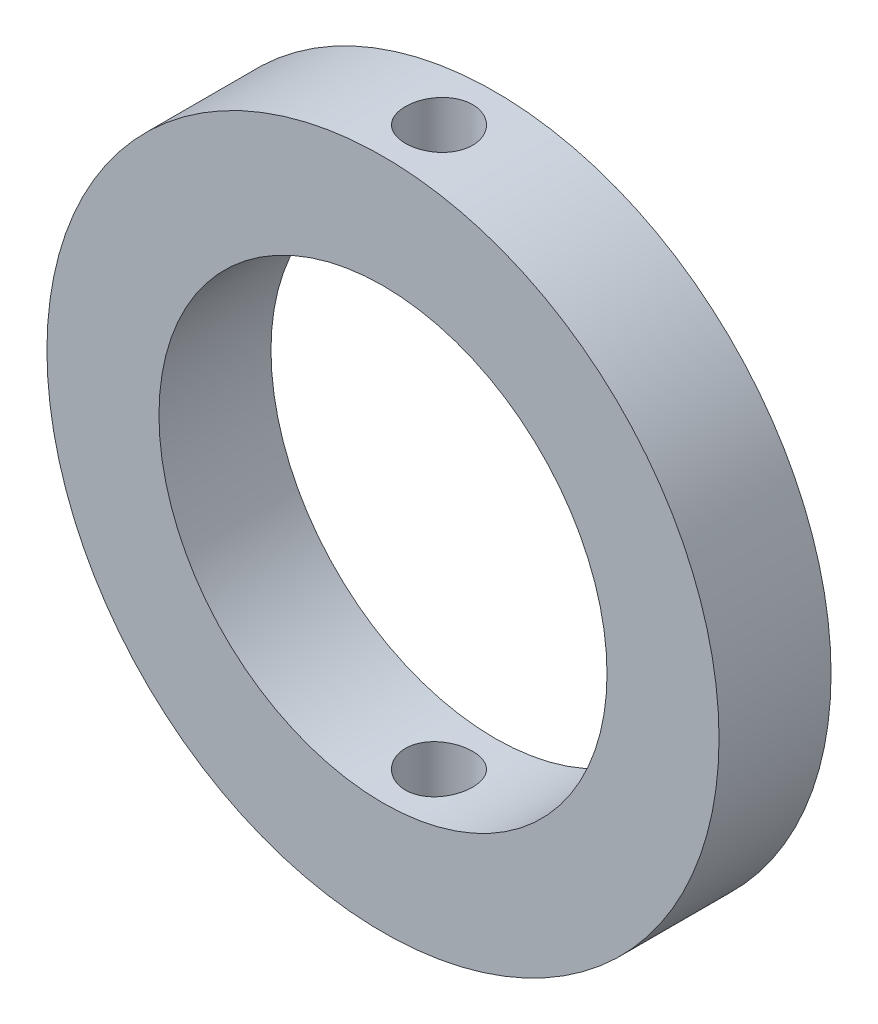
ISO-10303-21;
HEADER;
FILE_DESCRIPTION(('STEP AP214'),'2;1');
FILE_NAME('part.step','',(''),(''),'','','');
FILE_SCHEMA(('AUTOMOTIVE_DESIGN { 1 0 10303 214 1 1 1 1 }'));
ENDSEC;
DATA;
#1=APPLICATION_CONTEXT('core data for automotive mechanical design processes');
#2=APPLICATION_PROTOCOL_DEFINITION('international standard','automotive_design',2000,#1);
#3=PRODUCT_CONTEXT('',#1,'mechanical');
#4=PRODUCT('Part','Part','',(#3));
#5=PRODUCT_RELATED_PRODUCT_CATEGORY('part','',(#4));
#6=PRODUCT_DEFINITION_FORMATION('','',#4);
#7=PRODUCT_DEFINITION_CONTEXT('part definition',#1,'design');
#8=PRODUCT_DEFINITION('design','',#6,#7);
#9=PRODUCT_DEFINITION_SHAPE('','',#8);
#10=(LENGTH_UNIT() NAMED_UNIT(*) SI_UNIT(.MILLI.,.METRE.));
#11=(NAMED_UNIT(*) PLANE_ANGLE_UNIT() SI_UNIT($,.RADIAN.));
#12=(NAMED_UNIT(*) SI_UNIT($,.STERADIAN.) SOLID_ANGLE_UNIT());
#13=UNCERTAINTY_MEASURE_WITH_UNIT(LENGTH_MEASURE(1.E-05),#10,'distance_accuracy_value','');
#14=(GEOMETRIC_REPRESENTATION_CONTEXT(3) GLOBAL_UNCERTAINTY_ASSIGNED_CONTEXT((#13)) GLOBAL_UNIT_ASSIGNED_CONTEXT((#10,
#11,#12)) REPRESENTATION_CONTEXT('',''));
#15=CARTESIAN_POINT('',(0.,0.,0.));
#16=DIRECTION('',(0.,0.,1.));
#17=DIRECTION('',(1.,0.,0.));
#18=AXIS2_PLACEMENT_3D('',#15,#16,#17);
#19=CARTESIAN_POINT('',(0.,0.,10.));
#20=DIRECTION('',(0.,0.,1.));
#21=DIRECTION('',(1.,0.,0.));
#22=AXIS2_PLACEMENT_3D('',#19,#20,#21);
#23=PLANE('',#22);
#24=CARTESIAN_POINT('',(0.,0.,10.));
#25=DIRECTION('',(0.,0.,1.));
#26=DIRECTION('',(1.,0.,0.));
#27=AXIS2_PLACEMENT_3D('',#24,#25,#26);
#28=CIRCLE('',#27,30.);
#29=CARTESIAN_POINT('',(30.,0.,10.));
#30=VERTEX_POINT('',#29);
#31=EDGE_CURVE('E10',#30,#30,#28,.T.);
#32=ORIENTED_EDGE('',*,*,#31,.T.);
#33=EDGE_LOOP('',(#32));
#34=FACE_BOUND('',#33,.T.);
#35=CARTESIAN_POINT('',(0.,0.,10.));
#36=DIRECTION('',(0.,0.,1.));
#37=DIRECTION('',(1.,0.,0.));
#38=AXIS2_PLACEMENT_3D('',#35,#36,#37);
#39=CIRCLE('',#38,20.);
#40=CARTESIAN_POINT('',(20.,0.,10.));
#41=VERTEX_POINT('',#40);
#42=EDGE_CURVE('E58',#41,#41,#39,.T.);
#43=ORIENTED_EDGE('',*,*,#42,.F.);
#44=EDGE_LOOP('',(#43));
#45=FACE_BOUND('',#44,.T.);
#46=ADVANCED_FACE('F37',(#34,#45),#23,.T.);
#47=CARTESIAN_POINT('',(0.,0.,0.));
#48=DIRECTION('',(0.,0.,1.));
#49=DIRECTION('',(1.,0.,0.));
#50=AXIS2_PLACEMENT_3D('',#47,#48,#49);
#51=PLANE('',#50);
#52=CARTESIAN_POINT('',(0.,0.,0.));
#53=DIRECTION('',(0.,0.,1.));
#54=DIRECTION('',(1.,0.,0.));
#55=AXIS2_PLACEMENT_3D('',#52,#53,#54);
#56=CIRCLE('',#55,30.);
#57=CARTESIAN_POINT('',(30.,0.,0.));
#58=VERTEX_POINT('',#57);
#59=EDGE_CURVE('E52',#58,#58,#56,.T.);
#60=ORIENTED_EDGE('',*,*,#59,.F.);
#61=EDGE_LOOP('',(#60));
#62=FACE_BOUND('',#61,.T.);
#63=CARTESIAN_POINT('',(0.,0.,0.));
#64=DIRECTION('',(0.,0.,1.));
#65=DIRECTION('',(1.,0.,0.));
#66=AXIS2_PLACEMENT_3D('',#63,#64,#65);
#67=CIRCLE('',#66,20.);
#68=CARTESIAN_POINT('',(20.,0.,0.));
#69=VERTEX_POINT('',#68);
#70=EDGE_CURVE('E61',#69,#69,#67,.T.);
#71=ORIENTED_EDGE('',*,*,#70,.T.);
#72=EDGE_LOOP('',(#71));
#73=FACE_BOUND('',#72,.T.);
#74=ADVANCED_FACE('F102',(#62,#73),#51,.F.);
#75=CARTESIAN_POINT('',(0.,0.,10.));
#76=DIRECTION('',(0.,0.,-1.));
#77=DIRECTION('',(-1.,0.,0.));
#78=AXIS2_PLACEMENT_3D('',#75,#76,#77);
#79=CYLINDRICAL_SURFACE('',#78,30.);
#80=CARTESIAN_POINT('',(0.,-30.,8.));
#81=CARTESIAN_POINT('',(0.168061061374672,-29.9999980656231,7.99999272229886));
#82=CARTESIAN_POINT('',(0.336233235503319,-29.9985727678862,7.98583019331067));
#83=CARTESIAN_POINT('',(0.667915195490511,-29.9930240278421,7.92954688912872));
#84=CARTESIAN_POINT('',(0.831419637506484,-29.9888976130208,7.88739531192623));
#85=CARTESIAN_POINT('',(1.14891502636024,-29.9784124368921,7.7763732782065));
#86=CARTESIAN_POINT('',(1.30291165384473,-29.9720550240212,7.70751895844458));
#87=CARTESIAN_POINT('',(1.59712848288122,-29.9578187218292,7.54507727620507));
#88=CARTESIAN_POINT('',(1.73735141633723,-29.9499401351439,7.45149483199959));
#89=CARTESIAN_POINT('',(2.00057865202225,-29.9335123302397,7.24189190701318));
#90=CARTESIAN_POINT('',(2.12352643450468,-29.924961047216,7.1258006017939));
#91=CARTESIAN_POINT('',(2.34822756429295,-29.9081687071879,6.87462639721091));
#92=CARTESIAN_POINT('',(2.44997993124796,-29.8999276645475,6.73954261987284));
#93=CARTESIAN_POINT('',(2.62960191133085,-29.8846677465835,6.45386440494914));
#94=CARTESIAN_POINT('',(2.70742039636464,-29.8776515013271,6.30323766771542));
#95=CARTESIAN_POINT('',(2.83663915422828,-29.8656611263957,5.99097324228506));
#96=CARTESIAN_POINT('',(2.88804007977387,-29.8606869462667,5.82933582624815));
#97=CARTESIAN_POINT('',(2.96279712480568,-29.8533625221893,5.50021459740197));
#98=CARTESIAN_POINT('',(2.98624695901139,-29.8510035119429,5.33275226944338));
#99=CARTESIAN_POINT('',(3.00472585540608,-29.8491492918158,4.99625340981266));
#100=CARTESIAN_POINT('',(2.9997556646124,-29.8496540066624,4.82721691963382));
#101=CARTESIAN_POINT('',(2.96161284075803,-29.853462206968,4.49301407092004));
#102=CARTESIAN_POINT('',(2.92854253237365,-29.8567555377195,4.32783590201392));
#103=CARTESIAN_POINT('',(2.83529743245176,-29.8657540286226,4.00538611039672));
#104=CARTESIAN_POINT('',(2.77512227476724,-29.8714592213548,3.84811459452491));
#105=CARTESIAN_POINT('',(2.62926268164452,-29.8846502835621,3.54561923810333));
#106=CARTESIAN_POINT('',(2.54353284815994,-29.8921393172447,3.40041743153205));
#107=CARTESIAN_POINT('',(2.34903008205968,-29.9080515519864,3.12642435526435));
#108=CARTESIAN_POINT('',(2.24025647500952,-29.9164747803835,2.99763356605471));
#109=CARTESIAN_POINT('',(2.00218233723621,-29.9333515593897,2.75952381803292));
#110=CARTESIAN_POINT('',(1.87279343655409,-29.9418050799899,2.65029319435758));
#111=CARTESIAN_POINT('',(1.59746844521134,-29.9577548723555,2.45508910126884));
#112=CARTESIAN_POINT('',(1.4515323359988,-29.9652511430477,2.36911565793057));
#113=CARTESIAN_POINT('',(1.14719431707709,-29.9784442700129,2.22286993906924));
#114=CARTESIAN_POINT('',(0.98879023916971,-29.9841408124431,2.16260214554582));
#115=CARTESIAN_POINT('',(0.664041651989797,-29.9930894232423,2.06954324986474));
#116=CARTESIAN_POINT('',(0.497697380329801,-29.9963415647119,2.03675132602813));
#117=CARTESIAN_POINT('',(0.162555297275711,-30.0000255500493,1.9996870767957));
#118=CARTESIAN_POINT('',(-0.00622890631647575,-30.0004694480321,1.9952928552425));
#119=CARTESIAN_POINT('',(-0.342131379947099,-29.9985192527039,2.01482858914629));
#120=CARTESIAN_POINT('',(-0.50924967246141,-29.996125197734,2.03875816194584));
#121=CARTESIAN_POINT('',(-0.836724620504024,-29.9887758461758,2.11416108626473));
#122=CARTESIAN_POINT('',(-0.997094546916058,-29.9838258575412,2.16557736343403));
#123=CARTESIAN_POINT('',(-1.30693296415134,-29.9719199658183,2.29443552211181));
#124=CARTESIAN_POINT('',(-1.45640121047135,-29.9649640177576,2.37187798711819));
#125=CARTESIAN_POINT('',(-1.74074454051643,-29.9497942599127,2.55089251599174));
#126=CARTESIAN_POINT('',(-1.87556897924675,-29.9415763081032,2.65254466677745));
#127=CARTESIAN_POINT('',(-2.12628486993563,-29.9248179860856,2.87697820322278));
#128=CARTESIAN_POINT('',(-2.24217584654753,-29.9162776077891,2.99976011921095));
#129=CARTESIAN_POINT('',(-2.45215832966144,-29.8998007242226,3.263499723977));
#130=CARTESIAN_POINT('',(-2.54616983603863,-29.8918665041693,3.40452126962787));
#131=CARTESIAN_POINT('',(-2.70917477623148,-29.8775349738267,3.70042208044006));
#132=CARTESIAN_POINT('',(-2.77816855216165,-29.8711376425211,3.85530115606519));
#133=CARTESIAN_POINT('',(-2.88904562605342,-29.8606184290215,4.17424621839738));
#134=CARTESIAN_POINT('',(-2.93097652443558,-29.8564925534936,4.33829552027336));
#135=CARTESIAN_POINT('',(-2.98669202138839,-29.8509709584863,4.67114959388232));
#136=CARTESIAN_POINT('',(-3.00047742719855,-29.8495751607056,4.83995422908702));
#137=CARTESIAN_POINT('',(-2.99949941541377,-29.8496733932269,5.17673206507011));
#138=CARTESIAN_POINT('',(-2.98486166877934,-29.8511547026103,5.34470564864844));
#139=CARTESIAN_POINT('',(-2.92771635889096,-29.8568131166864,5.67579475150486));
#140=CARTESIAN_POINT('',(-2.88520876428648,-29.8609902244115,5.83891026531794));
#141=CARTESIAN_POINT('',(-2.77356505889251,-29.8715660478956,6.15565204714357));
#142=CARTESIAN_POINT('',(-2.70443263302275,-29.8779644562108,6.30927962488917));
#143=CARTESIAN_POINT('',(-2.54151466473313,-29.8922625551808,6.6027706750131));
#144=CARTESIAN_POINT('',(-2.44772926036624,-29.9001622374285,6.74263422446189));
#145=CARTESIAN_POINT('',(-2.23769566885599,-29.9166146162909,7.00527102341581));
#146=CARTESIAN_POINT('',(-2.12135384667081,-29.9251699418025,7.12796922910126));
#147=CARTESIAN_POINT('',(-1.86969509767533,-29.9419456418635,7.35215669809897));
#148=CARTESIAN_POINT('',(-1.73437363232477,-29.9501659356893,7.45364087407151));
#149=CARTESIAN_POINT('',(-1.44822430248387,-29.9653668620748,7.63272036156386));
#150=CARTESIAN_POINT('',(-1.29735824804029,-29.9723443208044,7.71025487283555));
#151=CARTESIAN_POINT('',(-0.984774837301653,-29.9842388774969,7.8387872684716));
#152=CARTESIAN_POINT('',(-0.823069949476829,-29.9891582972896,7.88981507286064));
#153=CARTESIAN_POINT('',(-0.550374784217113,-29.995146413212,7.9511618512544));
#154=CARTESIAN_POINT('',(-0.441127658533526,-29.996958020755,7.96945113289807));
#155=CARTESIAN_POINT('',(-0.221269742451939,-29.9993854485236,7.99387257818529));
#156=CARTESIAN_POINT('',(-0.110658957679674,-30.0000012736807,8.00000479196559));
#157=CARTESIAN_POINT('',(0.,-30.,8.));
#158=B_SPLINE_CURVE_WITH_KNOTS('',3,(#80,#81,#82,#83,#84,#85,#86,#87,#88,#89,#90,#91,#92,#93,
#94,#95,#96,#97,#98,#99,#100,#101,#102,#103,#104,#105,#106,#107,#108,#109,#110,#111,#112,#113,
#114,#115,#116,#117,#118,#119,#120,#121,#122,#123,#124,#125,#126,#127,#128,#129,#130,#131,#132,
#133,#134,#135,#136,#137,#138,#139,#140,#141,#142,#143,#144,#145,#146,#147,#148,#149,#150,#151,
#152,#153,#154,#155,#156,#157),.UNSPECIFIED.,.T.,.F.,(4,2,2,2,2,2,2,2,2,2,2,2,2,2,2,2,2,2,2,2,2,
2,2,2,2,2,2,2,2,2,2,2,2,2,2,2,2,2,4),(0.,0.503779098805421,1.00811352850646,1.51214365719661,
2.01607361274835,2.52161570586884,3.02718117662118,3.53381926416665,4.04044483327512,
4.5453669613559,5.0502758176733,5.55335392323331,6.05643882484901,6.56042284118684,
7.06442160993376,7.57064202588619,8.07686300939315,8.58317222080744,9.08946629026318,
9.59358565823273,10.0976982155743,10.6007680588291,11.103849181484,11.608618222461,
12.1133999343069,12.619999308258,13.1265917542612,13.6322907177901,14.1379751771876,
14.6414288788187,15.1448831467812,15.648267760884,16.1516495561688,16.6571675228296,
17.1628065791087,17.6697189307873,18.1760578438588,18.5077700169705,18.8394808220708),.UNSPECIFIED.);
#159=CARTESIAN_POINT('',(0.,-30.,8.));
#160=VERTEX_POINT('',#159);
#161=EDGE_CURVE('E88',#160,#160,#158,.T.);
#162=ORIENTED_EDGE('',*,*,#161,.T.);
#163=EDGE_LOOP('',(#162));
#164=FACE_BOUND('',#163,.T.);
#165=CARTESIAN_POINT('',(0.,30.,8.));
#166=CARTESIAN_POINT('',(-0.168061061374672,29.9999980656231,7.99999272229886));
#167=CARTESIAN_POINT('',(-0.336233235503319,29.9985727678862,7.98583019331067));
#168=CARTESIAN_POINT('',(-0.667915195490511,29.9930240278421,7.92954688912872));
#169=CARTESIAN_POINT('',(-0.831419637506484,29.9888976130208,7.88739531192623));
#170=CARTESIAN_POINT('',(-1.14891502636024,29.9784124368921,7.7763732782065));
#171=CARTESIAN_POINT('',(-1.30291165384473,29.9720550240212,7.70751895844458));
#172=CARTESIAN_POINT('',(-1.59712848288122,29.9578187218292,7.54507727620507));
#173=CARTESIAN_POINT('',(-1.73735141633723,29.9499401351439,7.45149483199959));
#174=CARTESIAN_POINT('',(-2.00057865202225,29.9335123302397,7.24189190701318));
#175=CARTESIAN_POINT('',(-2.12352643450468,29.924961047216,7.1258006017939));
#176=CARTESIAN_POINT('',(-2.34822756429295,29.9081687071879,6.87462639721091));
#177=CARTESIAN_POINT('',(-2.44997993124796,29.8999276645475,6.73954261987284));
#178=CARTESIAN_POINT('',(-2.62960191133085,29.8846677465835,6.45386440494914));
#179=CARTESIAN_POINT('',(-2.70742039636464,29.8776515013271,6.30323766771542));
#180=CARTESIAN_POINT('',(-2.83663915422828,29.8656611263957,5.99097324228506));
#181=CARTESIAN_POINT('',(-2.88804007977387,29.8606869462667,5.82933582624815));
#182=CARTESIAN_POINT('',(-2.96279712480568,29.8533625221893,5.50021459740197));
#183=CARTESIAN_POINT('',(-2.98624695901139,29.8510035119429,5.33275226944338));
#184=CARTESIAN_POINT('',(-3.00472585540608,29.8491492918158,4.99625340981266));
#185=CARTESIAN_POINT('',(-2.9997556646124,29.8496540066624,4.82721691963382));
#186=CARTESIAN_POINT('',(-2.96161284075803,29.853462206968,4.49301407092004));
#187=CARTESIAN_POINT('',(-2.92854253237365,29.8567555377195,4.32783590201392));
#188=CARTESIAN_POINT('',(-2.83529743245176,29.8657540286226,4.00538611039672));
#189=CARTESIAN_POINT('',(-2.77512227476724,29.8714592213548,3.84811459452491));
#190=CARTESIAN_POINT('',(-2.62926268164452,29.8846502835621,3.54561923810333));
#191=CARTESIAN_POINT('',(-2.54353284815994,29.8921393172447,3.40041743153205));
#192=CARTESIAN_POINT('',(-2.34903008205968,29.9080515519864,3.12642435526435));
#193=CARTESIAN_POINT('',(-2.24025647500952,29.9164747803835,2.99763356605471));
#194=CARTESIAN_POINT('',(-2.00218233723621,29.9333515593897,2.75952381803292));
#195=CARTESIAN_POINT('',(-1.87279343655409,29.9418050799899,2.65029319435758));
#196=CARTESIAN_POINT('',(-1.59746844521134,29.9577548723555,2.45508910126884));
#197=CARTESIAN_POINT('',(-1.4515323359988,29.9652511430477,2.36911565793057));
#198=CARTESIAN_POINT('',(-1.14719431707709,29.9784442700129,2.22286993906924));
#199=CARTESIAN_POINT('',(-0.98879023916971,29.9841408124431,2.16260214554582));
#200=CARTESIAN_POINT('',(-0.664041651989797,29.9930894232423,2.06954324986474));
#201=CARTESIAN_POINT('',(-0.497697380329801,29.9963415647119,2.03675132602813));
#202=CARTESIAN_POINT('',(-0.162555297275711,30.0000255500493,1.9996870767957));
#203=CARTESIAN_POINT('',(0.00622890631647575,30.0004694480321,1.9952928552425));
#204=CARTESIAN_POINT('',(0.342131379947099,29.9985192527039,2.01482858914629));
#205=CARTESIAN_POINT('',(0.50924967246141,29.996125197734,2.03875816194584));
#206=CARTESIAN_POINT('',(0.836724620504024,29.9887758461758,2.11416108626473));
#207=CARTESIAN_POINT('',(0.997094546916058,29.9838258575412,2.16557736343403));
#208=CARTESIAN_POINT('',(1.30693296415134,29.9719199658183,2.29443552211181));
#209=CARTESIAN_POINT('',(1.45640121047135,29.9649640177576,2.37187798711819));
#210=CARTESIAN_POINT('',(1.74074454051643,29.9497942599127,2.55089251599174));
#211=CARTESIAN_POINT('',(1.87556897924675,29.9415763081032,2.65254466677745));
#212=CARTESIAN_POINT('',(2.12628486993563,29.9248179860856,2.87697820322278));
#213=CARTESIAN_POINT('',(2.24217584654753,29.9162776077891,2.99976011921095));
#214=CARTESIAN_POINT('',(2.45215832966144,29.8998007242226,3.263499723977));
#215=CARTESIAN_POINT('',(2.54616983603863,29.8918665041693,3.40452126962787));
#216=CARTESIAN_POINT('',(2.70917477623148,29.8775349738267,3.70042208044006));
#217=CARTESIAN_POINT('',(2.77816855216165,29.8711376425211,3.85530115606519));
#218=CARTESIAN_POINT('',(2.88904562605342,29.8606184290215,4.17424621839738));
#219=CARTESIAN_POINT('',(2.93097652443558,29.8564925534936,4.33829552027336));
#220=CARTESIAN_POINT('',(2.98669202138839,29.8509709584863,4.67114959388232));
#221=CARTESIAN_POINT('',(3.00047742719855,29.8495751607056,4.83995422908702));
#222=CARTESIAN_POINT('',(2.99949941541377,29.8496733932269,5.17673206507011));
#223=CARTESIAN_POINT('',(2.98486166877934,29.8511547026103,5.34470564864844));
#224=CARTESIAN_POINT('',(2.92771635889096,29.8568131166864,5.67579475150486));
#225=CARTESIAN_POINT('',(2.88520876428648,29.8609902244115,5.83891026531794));
#226=CARTESIAN_POINT('',(2.77356505889251,29.8715660478956,6.15565204714357));
#227=CARTESIAN_POINT('',(2.70443263302275,29.8779644562108,6.30927962488917));
#228=CARTESIAN_POINT('',(2.54151466473313,29.8922625551808,6.6027706750131));
#229=CARTESIAN_POINT('',(2.44772926036624,29.9001622374285,6.74263422446189));
#230=CARTESIAN_POINT('',(2.23769566885599,29.9166146162909,7.00527102341581));
#231=CARTESIAN_POINT('',(2.12135384667081,29.9251699418025,7.12796922910126));
#232=CARTESIAN_POINT('',(1.86969509767533,29.9419456418635,7.35215669809897));
#233=CARTESIAN_POINT('',(1.73437363232477,29.9501659356893,7.45364087407151));
#234=CARTESIAN_POINT('',(1.44822430248387,29.9653668620748,7.63272036156386));
#235=CARTESIAN_POINT('',(1.29735824804029,29.9723443208044,7.71025487283555));
#236=CARTESIAN_POINT('',(0.984774837301653,29.9842388774969,7.8387872684716));
#237=CARTESIAN_POINT('',(0.823069949476829,29.9891582972896,7.88981507286064));
#238=CARTESIAN_POINT('',(0.550374784217113,29.995146413212,7.9511618512544));
#239=CARTESIAN_POINT('',(0.441127658533526,29.996958020755,7.96945113289807));
#240=CARTESIAN_POINT('',(0.221269742451939,29.9993854485236,7.99387257818529));
#241=CARTESIAN_POINT('',(0.110658957679674,30.0000012736807,8.00000479196559));
#242=CARTESIAN_POINT('',(0.,30.,8.));
#243=B_SPLINE_CURVE_WITH_KNOTS('',3,(#165,#166,#167,#168,#169,#170,#171,#172,#173,#174,#175,
#176,#177,#178,#179,#180,#181,#182,#183,#184,#185,#186,#187,#188,#189,#190,#191,#192,#193,#194,
#195,#196,#197,#198,#199,#200,#201,#202,#203,#204,#205,#206,#207,#208,#209,#210,#211,#212,#213,
#214,#215,#216,#217,#218,#219,#220,#221,#222,#223,#224,#225,#226,#227,#228,#229,#230,#231,#232,
#233,#234,#235,#236,#237,#238,#239,#240,#241,#242),.UNSPECIFIED.,.T.,.F.,(4,2,2,2,2,2,2,2,2,2,2,
2,2,2,2,2,2,2,2,2,2,2,2,2,2,2,2,2,2,2,2,2,2,2,2,2,2,2,4),(0.,0.503779098805421,1.00811352850646,
1.51214365719661,2.01607361274835,2.52161570586884,3.02718117662118,3.53381926416665,
4.04044483327512,4.5453669613559,5.0502758176733,5.55335392323331,6.05643882484901,
6.56042284118684,7.06442160993376,7.57064202588619,8.07686300939315,8.58317222080744,
9.08946629026318,9.59358565823273,10.0976982155743,10.6007680588291,11.103849181484,
11.608618222461,12.1133999343069,12.619999308258,13.1265917542612,13.6322907177901,
14.1379751771876,14.6414288788187,15.1448831467812,15.648267760884,16.1516495561688,
16.6571675228296,17.1628065791087,17.6697189307873,18.1760578438588,18.5077700169705,
18.8394808220708),.UNSPECIFIED.);
#244=CARTESIAN_POINT('',(0.,30.,8.));
#245=VERTEX_POINT('',#244);
#246=EDGE_CURVE('E82',#245,#245,#243,.T.);
#247=ORIENTED_EDGE('',*,*,#246,.T.);
#248=EDGE_LOOP('',(#247));
#249=FACE_BOUND('',#248,.T.);
#250=ORIENTED_EDGE('',*,*,#31,.F.);
#251=EDGE_LOOP('',(#250));
#252=FACE_BOUND('',#251,.T.);
#253=ORIENTED_EDGE('',*,*,#59,.T.);
#254=EDGE_LOOP('',(#253));
#255=FACE_BOUND('',#254,.T.);
#256=ADVANCED_FACE('F39',(#164,#249,#252,#255),#79,.T.);
#257=CARTESIAN_POINT('',(0.,0.,10.));
#258=DIRECTION('',(0.,0.,-1.));
#259=DIRECTION('',(-1.,0.,0.));
#260=AXIS2_PLACEMENT_3D('',#257,#258,#259);
#261=CYLINDRICAL_SURFACE('',#260,20.);
#262=CARTESIAN_POINT('',(0.,-20.,8.));
#263=CARTESIAN_POINT('',(0.167503088963284,-19.9999973154259,7.99999309236952));
#264=CARTESIAN_POINT('',(0.335103370164263,-19.9978736507408,7.98592399831873));
#265=CARTESIAN_POINT('',(0.665619255989826,-19.9896063194637,7.9300336000345));
#266=CARTESIAN_POINT('',(0.828530137948458,-19.9834587387695,7.88818527411021));
#267=CARTESIAN_POINT('',(1.14483617244372,-19.9678344243905,7.77801499006475));
#268=CARTESIAN_POINT('',(1.2982384156536,-19.9583602074184,7.7097130409881));
#269=CARTESIAN_POINT('',(1.59138085727051,-19.9371295182345,7.54862324116627));
#270=CARTESIAN_POINT('',(1.73112294945038,-19.9253733630555,7.45583879116528));
#271=CARTESIAN_POINT('',(1.99409343912425,-19.900783419829,7.24764547012025));
#272=CARTESIAN_POINT('',(2.117199664451,-19.8879426778066,7.13208308758359));
#273=CARTESIAN_POINT('',(2.34234981337897,-19.8626852226648,6.88194462221226));
#274=CARTESIAN_POINT('',(2.44439252545871,-19.8502685339701,6.74736744644296));
#275=CARTESIAN_POINT('',(2.62499458999886,-19.8271975491745,6.46219871295502));
#276=CARTESIAN_POINT('',(2.7034357407441,-19.8165522395006,6.31153150603733));
#277=CARTESIAN_POINT('',(2.83385264342112,-19.7983242261254,5.99897435870915));
#278=CARTESIAN_POINT('',(2.88582983778326,-19.790741355509,5.83708503051222));
#279=CARTESIAN_POINT('',(2.96146397597822,-19.7795651243735,5.50796391625657));
#280=CARTESIAN_POINT('',(2.98533007281035,-19.775942314825,5.34078121318395));
#281=CARTESIAN_POINT('',(3.00471248067865,-19.7730069794116,5.00474766802544));
#282=CARTESIAN_POINT('',(3.00023041947592,-19.7736942060629,4.83589692227501));
#283=CARTESIAN_POINT('',(2.96321466501575,-19.7792743670482,4.50279783961172));
#284=CARTESIAN_POINT('',(2.93091391855501,-19.784132375231,4.33852294703039));
#285=CARTESIAN_POINT('',(2.83954234807468,-19.7974521625273,4.01775126225694));
#286=CARTESIAN_POINT('',(2.78047076675624,-19.8059140435876,3.86125469023851));
#287=CARTESIAN_POINT('',(2.63699207059473,-19.8255267109096,3.55977325743428));
#288=CARTESIAN_POINT('',(2.55248628566395,-19.8366879353305,3.41483606181522));
#289=CARTESIAN_POINT('',(2.36060826257909,-19.860434151491,3.14111080843613));
#290=CARTESIAN_POINT('',(2.25323452364956,-19.87301923665,3.01232381146126));
#291=CARTESIAN_POINT('',(2.01738986156496,-19.8983494611242,2.77320467852057));
#292=CARTESIAN_POINT('',(1.888718659284,-19.9110949422563,2.66307001942732));
#293=CARTESIAN_POINT('',(1.61461417978837,-19.9351929529692,2.46592813098548));
#294=CARTESIAN_POINT('',(1.46918082917634,-19.9465454764502,2.37892100291221));
#295=CARTESIAN_POINT('',(1.16550919642737,-19.9665903117079,2.23049382700091));
#296=CARTESIAN_POINT('',(1.00726335567356,-19.9752810385086,2.16908901631941));
#297=CARTESIAN_POINT('',(0.682546364974121,-19.9890098111414,2.07378122062925));
#298=CARTESIAN_POINT('',(0.5160757719052,-19.9940481039093,2.03987637636885));
#299=CARTESIAN_POINT('',(0.181339135287292,-19.9998716226774,2.00079354036661));
#300=CARTESIAN_POINT('',(0.0131054637409395,-20.0006970418078,1.99534405724135));
#301=CARTESIAN_POINT('',(-0.321873355324567,-19.9981112203045,2.01260601062205));
#302=CARTESIAN_POINT('',(-0.488618548763755,-19.9947001108274,2.03531657533619));
#303=CARTESIAN_POINT('',(-0.815064774862816,-19.9840493723067,2.10802820035508));
#304=CARTESIAN_POINT('',(-0.974795926159676,-19.9768283041597,2.15789699206169));
#305=CARTESIAN_POINT('',(-1.283629917286,-19.9593647131674,2.28336999492351));
#306=CARTESIAN_POINT('',(-1.4327322575902,-19.9491220484313,2.35897541466726));
#307=CARTESIAN_POINT('',(-1.71726995858384,-19.9266536493737,2.53441244912772));
#308=CARTESIAN_POINT('',(-1.85259801978313,-19.9144140325349,2.63441628002554));
#309=CARTESIAN_POINT('',(-2.10464734635541,-19.8893572602433,2.85557162325749));
#310=CARTESIAN_POINT('',(-2.22136752958681,-19.8765400712573,2.9767243646493));
#311=CARTESIAN_POINT('',(-2.43387569914391,-19.8516452860899,3.23794706635298));
#312=CARTESIAN_POINT('',(-2.52948169494842,-19.8395747203518,3.37816585038954));
#313=CARTESIAN_POINT('',(-2.69578258541168,-19.8176643820981,3.67283208102354));
#314=CARTESIAN_POINT('',(-2.76647815312872,-19.8078245493126,3.82727914304293));
#315=CARTESIAN_POINT('',(-2.88066934647887,-19.7915406601729,4.14547506724626));
#316=CARTESIAN_POINT('',(-2.92426074283271,-19.7850846601288,4.30918892194248));
#317=CARTESIAN_POINT('',(-2.98331099003173,-19.776267645956,4.64171803087021));
#318=CARTESIAN_POINT('',(-2.99877178366133,-19.7739063490354,4.81053293198935));
#319=CARTESIAN_POINT('',(-3.0010757333888,-19.7735566522168,5.14665812663156));
#320=CARTESIAN_POINT('',(-2.98820504334625,-19.77552452667,5.31396648351384));
#321=CARTESIAN_POINT('',(-2.93482459088757,-19.7835164122235,5.64401052664704));
#322=CARTESIAN_POINT('',(-2.89431487277254,-19.7895404168224,5.80674622022679));
#323=CARTESIAN_POINT('',(-2.7869074703733,-19.8049505222459,6.12294616446865));
#324=CARTESIAN_POINT('',(-2.72002978648628,-19.8143340743215,6.27641734086688));
#325=CARTESIAN_POINT('',(-2.56181335284618,-19.835409091154,6.5700072676048));
#326=CARTESIAN_POINT('',(-2.47047377483004,-19.8471006340545,6.71012556560729));
#327=CARTESIAN_POINT('',(-2.26488675318328,-19.8716148672988,6.97448611595034));
#328=CARTESIAN_POINT('',(-2.15042738079611,-19.8844473576393,7.09856266649413));
#329=CARTESIAN_POINT('',(-1.90229768216567,-19.9097157765327,7.32584910957565));
#330=CARTESIAN_POINT('',(-1.76862289670188,-19.9221516122152,7.42905414515232));
#331=CARTESIAN_POINT('',(-1.48499141508744,-19.9453037158104,7.61217535321473));
#332=CARTESIAN_POINT('',(-1.33494915352952,-19.9560101425764,7.69196021842949));
#333=CARTESIAN_POINT('',(-1.02350374049744,-19.9744005760592,7.82507703351609));
#334=CARTESIAN_POINT('',(-0.862112554193407,-19.9820877113151,7.87843638010738));
#335=CARTESIAN_POINT('',(-0.583331455778656,-19.9918187852301,7.94508268542021));
#336=CARTESIAN_POINT('',(-0.467662266990554,-19.9948709835911,7.96564520307762));
#337=CARTESIAN_POINT('',(-0.234677943200249,-19.9989625189579,7.99310619542529));
#338=CARTESIAN_POINT('',(-0.117362828668833,-20.0000018809755,8.00000483990509));
#339=CARTESIAN_POINT('',(0.,-20.,8.));
#340=B_SPLINE_CURVE_WITH_KNOTS('',3,(#262,#263,#264,#265,#266,#267,#268,#269,#270,#271,#272,
#273,#274,#275,#276,#277,#278,#279,#280,#281,#282,#283,#284,#285,#286,#287,#288,#289,#290,#291,
#292,#293,#294,#295,#296,#297,#298,#299,#300,#301,#302,#303,#304,#305,#306,#307,#308,#309,#310,
#311,#312,#313,#314,#315,#316,#317,#318,#319,#320,#321,#322,#323,#324,#325,#326,#327,#328,#329,
#330,#331,#332,#333,#334,#335,#336,#337,#338,#339),.UNSPECIFIED.,.T.,.F.,(4,2,2,2,2,2,2,2,2,2,2,
2,2,2,2,2,2,2,2,2,2,2,2,2,2,2,2,2,2,2,2,2,2,2,2,2,2,2,4),(0.,0.502080410063326,1.0046499258583,
1.50684004716647,2.0089604483952,2.51458832273687,3.0202452714516,3.5283940479075,
4.03651512451012,4.54083129211849,5.04511850197965,5.54522354391493,6.04534273380722,
6.54742766952318,7.04954556617068,7.55668582510817,8.06382830477336,8.57127217969749,
9.07868174386802,9.5812411708851,10.0837850398231,10.583902979319,11.0840444075255,
11.5878237607381,12.0916324005726,12.5996273316934,13.1076085361766,13.6137844691434,
14.1199254427435,14.6209777652213,15.1220292845913,15.6227014796829,16.1233906293376,
16.6288965993144,17.1345200693747,17.6429264676947,18.1508046652288,18.5025970395762,
18.8543850424658),.UNSPECIFIED.);
#341=CARTESIAN_POINT('',(0.,-20.,8.));
#342=VERTEX_POINT('',#341);
#343=EDGE_CURVE('E42',#342,#342,#340,.T.);
#344=ORIENTED_EDGE('',*,*,#343,.F.);
#345=EDGE_LOOP('',(#344));
#346=FACE_BOUND('',#345,.T.);
#347=CARTESIAN_POINT('',(0.,20.,8.));
#348=CARTESIAN_POINT('',(-0.167503088963284,19.9999973154259,7.99999309236952));
#349=CARTESIAN_POINT('',(-0.335103370164263,19.9978736507408,7.98592399831873));
#350=CARTESIAN_POINT('',(-0.665619255989826,19.9896063194637,7.9300336000345));
#351=CARTESIAN_POINT('',(-0.828530137948458,19.9834587387695,7.88818527411021));
#352=CARTESIAN_POINT('',(-1.14483617244372,19.9678344243905,7.77801499006475));
#353=CARTESIAN_POINT('',(-1.2982384156536,19.9583602074184,7.7097130409881));
#354=CARTESIAN_POINT('',(-1.59138085727051,19.9371295182345,7.54862324116627));
#355=CARTESIAN_POINT('',(-1.73112294945038,19.9253733630555,7.45583879116528));
#356=CARTESIAN_POINT('',(-1.99409343912425,19.900783419829,7.24764547012025));
#357=CARTESIAN_POINT('',(-2.117199664451,19.8879426778066,7.13208308758359));
#358=CARTESIAN_POINT('',(-2.34234981337897,19.8626852226648,6.88194462221226));
#359=CARTESIAN_POINT('',(-2.44439252545871,19.8502685339701,6.74736744644296));
#360=CARTESIAN_POINT('',(-2.62499458999886,19.8271975491745,6.46219871295502));
#361=CARTESIAN_POINT('',(-2.7034357407441,19.8165522395006,6.31153150603733));
#362=CARTESIAN_POINT('',(-2.83385264342112,19.7983242261254,5.99897435870915));
#363=CARTESIAN_POINT('',(-2.88582983778326,19.790741355509,5.83708503051222));
#364=CARTESIAN_POINT('',(-2.96146397597822,19.7795651243735,5.50796391625657));
#365=CARTESIAN_POINT('',(-2.98533007281035,19.775942314825,5.34078121318395));
#366=CARTESIAN_POINT('',(-3.00471248067865,19.7730069794116,5.00474766802544));
#367=CARTESIAN_POINT('',(-3.00023041947592,19.7736942060629,4.83589692227501));
#368=CARTESIAN_POINT('',(-2.96321466501575,19.7792743670482,4.50279783961172));
#369=CARTESIAN_POINT('',(-2.93091391855501,19.784132375231,4.33852294703039));
#370=CARTESIAN_POINT('',(-2.83954234807468,19.7974521625273,4.01775126225694));
#371=CARTESIAN_POINT('',(-2.78047076675624,19.8059140435876,3.86125469023851));
#372=CARTESIAN_POINT('',(-2.63699207059473,19.8255267109096,3.55977325743428));
#373=CARTESIAN_POINT('',(-2.55248628566395,19.8366879353305,3.41483606181522));
#374=CARTESIAN_POINT('',(-2.36060826257909,19.860434151491,3.14111080843613));
#375=CARTESIAN_POINT('',(-2.25323452364956,19.87301923665,3.01232381146126));
#376=CARTESIAN_POINT('',(-2.01738986156496,19.8983494611242,2.77320467852057));
#377=CARTESIAN_POINT('',(-1.888718659284,19.9110949422563,2.66307001942732));
#378=CARTESIAN_POINT('',(-1.61461417978837,19.9351929529692,2.46592813098548));
#379=CARTESIAN_POINT('',(-1.46918082917634,19.9465454764502,2.37892100291221));
#380=CARTESIAN_POINT('',(-1.16550919642737,19.9665903117079,2.23049382700091));
#381=CARTESIAN_POINT('',(-1.00726335567356,19.9752810385086,2.16908901631941));
#382=CARTESIAN_POINT('',(-0.682546364974121,19.9890098111414,2.07378122062925));
#383=CARTESIAN_POINT('',(-0.5160757719052,19.9940481039093,2.03987637636885));
#384=CARTESIAN_POINT('',(-0.181339135287292,19.9998716226774,2.00079354036661));
#385=CARTESIAN_POINT('',(-0.0131054637409395,20.0006970418078,1.99534405724135));
#386=CARTESIAN_POINT('',(0.321873355324567,19.9981112203045,2.01260601062205));
#387=CARTESIAN_POINT('',(0.488618548763755,19.9947001108274,2.03531657533619));
#388=CARTESIAN_POINT('',(0.815064774862816,19.9840493723067,2.10802820035508));
#389=CARTESIAN_POINT('',(0.974795926159676,19.9768283041597,2.15789699206169));
#390=CARTESIAN_POINT('',(1.283629917286,19.9593647131674,2.28336999492351));
#391=CARTESIAN_POINT('',(1.4327322575902,19.9491220484313,2.35897541466726));
#392=CARTESIAN_POINT('',(1.71726995858384,19.9266536493737,2.53441244912772));
#393=CARTESIAN_POINT('',(1.85259801978313,19.9144140325349,2.63441628002554));
#394=CARTESIAN_POINT('',(2.10464734635541,19.8893572602433,2.85557162325749));
#395=CARTESIAN_POINT('',(2.22136752958681,19.8765400712573,2.9767243646493));
#396=CARTESIAN_POINT('',(2.43387569914391,19.8516452860899,3.23794706635298));
#397=CARTESIAN_POINT('',(2.52948169494842,19.8395747203518,3.37816585038954));
#398=CARTESIAN_POINT('',(2.69578258541168,19.8176643820981,3.67283208102354));
#399=CARTESIAN_POINT('',(2.76647815312872,19.8078245493126,3.82727914304293));
#400=CARTESIAN_POINT('',(2.88066934647887,19.7915406601729,4.14547506724626));
#401=CARTESIAN_POINT('',(2.92426074283271,19.7850846601288,4.30918892194248));
#402=CARTESIAN_POINT('',(2.98331099003173,19.776267645956,4.64171803087021));
#403=CARTESIAN_POINT('',(2.99877178366133,19.7739063490354,4.81053293198935));
#404=CARTESIAN_POINT('',(3.0010757333888,19.7735566522168,5.14665812663156));
#405=CARTESIAN_POINT('',(2.98820504334625,19.77552452667,5.31396648351384));
#406=CARTESIAN_POINT('',(2.93482459088757,19.7835164122235,5.64401052664704));
#407=CARTESIAN_POINT('',(2.89431487277254,19.7895404168224,5.80674622022679));
#408=CARTESIAN_POINT('',(2.7869074703733,19.8049505222459,6.12294616446865));
#409=CARTESIAN_POINT('',(2.72002978648628,19.8143340743215,6.27641734086688));
#410=CARTESIAN_POINT('',(2.56181335284618,19.835409091154,6.5700072676048));
#411=CARTESIAN_POINT('',(2.47047377483004,19.8471006340545,6.71012556560729));
#412=CARTESIAN_POINT('',(2.26488675318328,19.8716148672988,6.97448611595034));
#413=CARTESIAN_POINT('',(2.15042738079611,19.8844473576393,7.09856266649413));
#414=CARTESIAN_POINT('',(1.90229768216567,19.9097157765327,7.32584910957565));
#415=CARTESIAN_POINT('',(1.76862289670188,19.9221516122152,7.42905414515232));
#416=CARTESIAN_POINT('',(1.48499141508744,19.9453037158104,7.61217535321473));
#417=CARTESIAN_POINT('',(1.33494915352952,19.9560101425764,7.69196021842949));
#418=CARTESIAN_POINT('',(1.02350374049744,19.9744005760592,7.82507703351609));
#419=CARTESIAN_POINT('',(0.862112554193407,19.9820877113151,7.87843638010738));
#420=CARTESIAN_POINT('',(0.583331455778656,19.9918187852301,7.94508268542021));
#421=CARTESIAN_POINT('',(0.467662266990554,19.9948709835911,7.96564520307762));
#422=CARTESIAN_POINT('',(0.234677943200249,19.9989625189579,7.99310619542529));
#423=CARTESIAN_POINT('',(0.117362828668833,20.0000018809755,8.00000483990509));
#424=CARTESIAN_POINT('',(0.,20.,8.));
#425=B_SPLINE_CURVE_WITH_KNOTS('',3,(#347,#348,#349,#350,#351,#352,#353,#354,#355,#356,#357,
#358,#359,#360,#361,#362,#363,#364,#365,#366,#367,#368,#369,#370,#371,#372,#373,#374,#375,#376,
#377,#378,#379,#380,#381,#382,#383,#384,#385,#386,#387,#388,#389,#390,#391,#392,#393,#394,#395,
#396,#397,#398,#399,#400,#401,#402,#403,#404,#405,#406,#407,#408,#409,#410,#411,#412,#413,#414,
#415,#416,#417,#418,#419,#420,#421,#422,#423,#424),.UNSPECIFIED.,.T.,.F.,(4,2,2,2,2,2,2,2,2,2,2,
2,2,2,2,2,2,2,2,2,2,2,2,2,2,2,2,2,2,2,2,2,2,2,2,2,2,2,4),(0.,0.502080410063326,1.0046499258583,
1.50684004716647,2.0089604483952,2.51458832273687,3.0202452714516,3.5283940479075,
4.03651512451012,4.54083129211849,5.04511850197965,5.54522354391493,6.04534273380722,
6.54742766952318,7.04954556617068,7.55668582510817,8.06382830477336,8.57127217969749,
9.07868174386802,9.5812411708851,10.0837850398231,10.583902979319,11.0840444075255,
11.5878237607381,12.0916324005726,12.5996273316934,13.1076085361766,13.6137844691434,
14.1199254427435,14.6209777652213,15.1220292845913,15.6227014796829,16.1233906293376,
16.6288965993144,17.1345200693747,17.6429264676947,18.1508046652288,18.5025970395762,
18.8543850424658),.UNSPECIFIED.);
#426=CARTESIAN_POINT('',(0.,20.,8.));
#427=VERTEX_POINT('',#426);
#428=EDGE_CURVE('E63',#427,#427,#425,.T.);
#429=ORIENTED_EDGE('',*,*,#428,.F.);
#430=EDGE_LOOP('',(#429));
#431=FACE_BOUND('',#430,.T.);
#432=ORIENTED_EDGE('',*,*,#42,.T.);
#433=EDGE_LOOP('',(#432));
#434=FACE_BOUND('',#433,.T.);
#435=ORIENTED_EDGE('',*,*,#70,.F.);
#436=EDGE_LOOP('',(#435));
#437=FACE_BOUND('',#436,.T.);
#438=ADVANCED_FACE('F69',(#346,#431,#434,#437),#261,.F.);
#439=CARTESIAN_POINT('',(0.,-30.,5.));
#440=DIRECTION('',(0.,1.,0.));
#441=DIRECTION('',(0.,0.,1.));
#442=AXIS2_PLACEMENT_3D('',#439,#440,#441);
#443=CYLINDRICAL_SURFACE('',#442,3.);
#444=ORIENTED_EDGE('',*,*,#428,.T.);
#445=EDGE_LOOP('',(#444));
#446=FACE_BOUND('',#445,.T.);
#447=ORIENTED_EDGE('',*,*,#246,.F.);
#448=EDGE_LOOP('',(#447));
#449=FACE_BOUND('',#448,.T.);
#450=ADVANCED_FACE('F75',(#446,#449),#443,.F.);
#451=ORIENTED_EDGE('',*,*,#343,.T.);
#452=EDGE_LOOP('',(#451));
#453=FACE_BOUND('',#452,.T.);
#454=ORIENTED_EDGE('',*,*,#161,.F.);
#455=EDGE_LOOP('',(#454));
#456=FACE_BOUND('',#455,.T.);
#457=ADVANCED_FACE('F72',(#453,#456),#443,.F.);
#458=CLOSED_SHELL('',(#46,#74,#256,#438,#450,#457));
#459=MANIFOLD_SOLID_BREP('B2',#458);
#460=ADVANCED_BREP_SHAPE_REPRESENTATION('',(#18,#459),#14);
#461=SHAPE_DEFINITION_REPRESENTATION(#9,#460);
ENDSEC;
END-ISO-10303-21;
